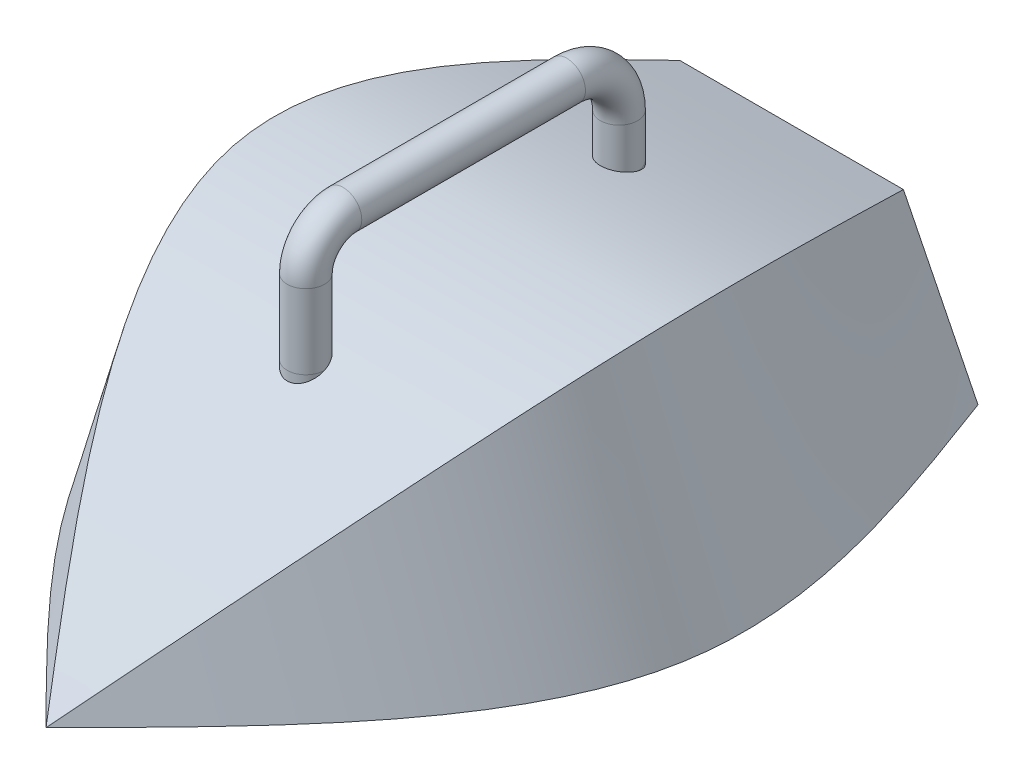
ISO-10303-21;
HEADER;
FILE_DESCRIPTION(('STEP AP214'),'2;1');
FILE_NAME('part.step','',(''),(''),'','','');
FILE_SCHEMA(('AUTOMOTIVE_DESIGN { 1 0 10303 214 1 1 1 1 }'));
ENDSEC;
DATA;
#1=APPLICATION_CONTEXT('core data for automotive mechanical design processes');
#2=APPLICATION_PROTOCOL_DEFINITION('international standard','automotive_design',2000,#1);
#3=PRODUCT_CONTEXT('',#1,'mechanical');
#4=PRODUCT('Part','Part','',(#3));
#5=PRODUCT_RELATED_PRODUCT_CATEGORY('part','',(#4));
#6=PRODUCT_DEFINITION_FORMATION('','',#4);
#7=PRODUCT_DEFINITION_CONTEXT('part definition',#1,'design');
#8=PRODUCT_DEFINITION('design','',#6,#7);
#9=PRODUCT_DEFINITION_SHAPE('','',#8);
#10=(LENGTH_UNIT() NAMED_UNIT(*) SI_UNIT(.MILLI.,.METRE.));
#11=(NAMED_UNIT(*) PLANE_ANGLE_UNIT() SI_UNIT($,.RADIAN.));
#12=(NAMED_UNIT(*) SI_UNIT($,.STERADIAN.) SOLID_ANGLE_UNIT());
#13=UNCERTAINTY_MEASURE_WITH_UNIT(LENGTH_MEASURE(1.E-05),#10,'distance_accuracy_value','');
#14=(GEOMETRIC_REPRESENTATION_CONTEXT(3) GLOBAL_UNCERTAINTY_ASSIGNED_CONTEXT((#13)) GLOBAL_UNIT_ASSIGNED_CONTEXT((#10,
#11,#12)) REPRESENTATION_CONTEXT('',''));
#15=CARTESIAN_POINT('',(0.,0.,0.));
#16=DIRECTION('',(0.,0.,1.));
#17=DIRECTION('',(1.,0.,0.));
#18=AXIS2_PLACEMENT_3D('',#15,#16,#17);
#19=CARTESIAN_POINT('',(0.,0.,0.));
#20=DIRECTION('',(0.,0.,1.));
#21=DIRECTION('',(1.,0.,0.));
#22=AXIS2_PLACEMENT_3D('',#19,#20,#21);
#23=PLANE('',#22);
#24=DIRECTION('',(-0.447213595499958,-0.894427190999916,0.));
#25=VECTOR('',#24,1.);
#26=CARTESIAN_POINT('',(-15.,20.,0.));
#27=LINE('',#26,#25);
#28=CARTESIAN_POINT('',(-15.,20.,0.));
#29=VERTEX_POINT('',#28);
#30=CARTESIAN_POINT('',(-25.,0.,0.));
#31=VERTEX_POINT('',#30);
#32=EDGE_CURVE('E214',#29,#31,#27,.T.);
#33=ORIENTED_EDGE('',*,*,#32,.F.);
#34=DIRECTION('',(-1.,0.,0.));
#35=VECTOR('',#34,1.);
#36=CARTESIAN_POINT('',(15.,20.,0.));
#37=LINE('',#36,#35);
#38=CARTESIAN_POINT('',(15.,20.,0.));
#39=VERTEX_POINT('',#38);
#40=EDGE_CURVE('E219',#39,#29,#37,.T.);
#41=ORIENTED_EDGE('',*,*,#40,.F.);
#42=DIRECTION('',(-0.447213595499958,0.894427190999916,0.));
#43=VECTOR('',#42,1.);
#44=CARTESIAN_POINT('',(25.,0.,0.));
#45=LINE('',#44,#43);
#46=CARTESIAN_POINT('',(25.,0.,0.));
#47=VERTEX_POINT('',#46);
#48=EDGE_CURVE('E213',#47,#39,#45,.T.);
#49=ORIENTED_EDGE('',*,*,#48,.F.);
#50=DIRECTION('',(1.,0.,0.));
#51=VECTOR('',#50,1.);
#52=CARTESIAN_POINT('',(-25.,0.,0.));
#53=LINE('',#52,#51);
#54=EDGE_CURVE('E204',#31,#47,#53,.T.);
#55=ORIENTED_EDGE('',*,*,#54,.F.);
#56=EDGE_LOOP('',(#33,#41,#49,#55));
#57=FACE_BOUND('',#56,.T.);
#58=DIRECTION('',(-1.,0.,0.));
#59=VECTOR('',#58,1.);
#60=CARTESIAN_POINT('',(0.,6.,0.));
#61=LINE('',#60,#59);
#62=CARTESIAN_POINT('',(4.,6.,0.));
#63=VERTEX_POINT('',#62);
#64=CARTESIAN_POINT('',(-4.,6.,0.));
#65=VERTEX_POINT('',#64);
#66=EDGE_CURVE('E125',#63,#65,#61,.T.);
#67=ORIENTED_EDGE('',*,*,#66,.F.);
#68=DIRECTION('',(0.,-1.,0.));
#69=VECTOR('',#68,1.);
#70=CARTESIAN_POINT('',(4.,0.,0.));
#71=LINE('',#70,#69);
#72=CARTESIAN_POINT('',(4.,12.,0.));
#73=VERTEX_POINT('',#72);
#74=EDGE_CURVE('E454',#73,#63,#71,.T.);
#75=ORIENTED_EDGE('',*,*,#74,.F.);
#76=DIRECTION('',(-0.894427190999916,0.447213595499958,0.));
#77=VECTOR('',#76,1.);
#78=CARTESIAN_POINT('',(0.,14.,0.));
#79=LINE('',#78,#77);
#80=CARTESIAN_POINT('',(0.,14.,0.));
#81=VERTEX_POINT('',#80);
#82=EDGE_CURVE('E286',#81,#73,#79,.F.);
#83=ORIENTED_EDGE('',*,*,#82,.F.);
#84=DIRECTION('',(-0.894427190999916,-0.447213595499958,0.));
#85=VECTOR('',#84,1.);
#86=CARTESIAN_POINT('',(0.,14.,0.));
#87=LINE('',#86,#85);
#88=CARTESIAN_POINT('',(-4.,12.,0.));
#89=VERTEX_POINT('',#88);
#90=EDGE_CURVE('E457',#89,#81,#87,.F.);
#91=ORIENTED_EDGE('',*,*,#90,.F.);
#92=DIRECTION('',(0.,-1.,0.));
#93=VECTOR('',#92,1.);
#94=CARTESIAN_POINT('',(-4.,0.,0.));
#95=LINE('',#94,#93);
#96=EDGE_CURVE('E452',#65,#89,#95,.F.);
#97=ORIENTED_EDGE('',*,*,#96,.F.);
#98=EDGE_LOOP('',(#67,#75,#83,#91,#97));
#99=FACE_BOUND('',#98,.T.);
#100=ADVANCED_FACE('F55',(#57,#99),#23,.F.);
#101=CARTESIAN_POINT('',(25.,0.,0.));
#102=CARTESIAN_POINT('',(31.4095388102639,0.,17.2166603380316));
#103=CARTESIAN_POINT('',(45.2982267037996,0.,54.5230608579921));
#104=CARTESIAN_POINT('',(15.8552403358976,0.,84.0822069139179));
#105=CARTESIAN_POINT('',(0.,0.,100.));
#106=CARTESIAN_POINT('',(21.6666666666667,6.66666666666667,0.));
#107=CARTESIAN_POINT('',(27.8564864589559,8.69332009443399,17.2166603380316));
#108=CARTESIAN_POINT('',(41.2690700717847,13.0848305852591,54.5230608579921));
#109=CARTESIAN_POINT('',(14.4449589319632,4.57993940999867,84.0822069139179));
#110=CARTESIAN_POINT('',(0.,0.,100.));
#111=CARTESIAN_POINT('',(18.3333333333333,13.3333333333333,0.));
#112=CARTESIAN_POINT('',(24.303434107648,17.386640188868,17.2166603380316));
#113=CARTESIAN_POINT('',(37.2399134397698,26.1696611705182,54.5230608579921));
#114=CARTESIAN_POINT('',(13.0346775280288,9.15987881999734,84.0822069139179));
#115=CARTESIAN_POINT('',(0.,0.,100.));
#116=CARTESIAN_POINT('',(15.,20.,0.));
#117=CARTESIAN_POINT('',(20.75038175634,26.079960283302,17.2166603380316));
#118=CARTESIAN_POINT('',(33.2107568077549,39.2544917557773,54.5230608579922));
#119=CARTESIAN_POINT('',(11.6243961240944,13.739818229996,84.0822069139179));
#120=CARTESIAN_POINT('',(0.,0.,100.));
#121=B_SPLINE_SURFACE_WITH_KNOTS('',3,3,((#101,#102,#103,#104,#105),(#106,#107,#108,#109,#110),
(#111,#112,#113,#114,#115),(#116,#117,#118,#119,#120)),.UNSPECIFIED.,.F.,.F.,.F.,(4,4),(4,1,4),
(0.,1.),(0.,0.461493472918138,1.),.UNSPECIFIED.);
#122=CARTESIAN_POINT('',(15.,20.,0.));
#123=CARTESIAN_POINT('',(20.75038175634,26.079960283302,17.2166603380316));
#124=CARTESIAN_POINT('',(33.2107568077549,39.2544917557773,54.5230608579922));
#125=CARTESIAN_POINT('',(11.6243961240944,13.739818229996,84.0822069139179));
#126=CARTESIAN_POINT('',(0.,0.,100.));
#127=B_SPLINE_CURVE_WITH_KNOTS('',3,(#122,#123,#124,#125,#126),.UNSPECIFIED.,.F.,.F.,(4,1,4),
(0.,0.461493472918138,1.),.UNSPECIFIED.);
#128=CARTESIAN_POINT('',(0.,0.,100.));
#129=VERTEX_POINT('',#128);
#130=EDGE_CURVE('E244',#39,#129,#127,.T.);
#131=CARTESIAN_POINT('',(25.,0.,0.));
#132=CARTESIAN_POINT('',(31.4095388102639,0.,17.2166603380316));
#133=CARTESIAN_POINT('',(45.2982267037996,0.,54.5230608579921));
#134=CARTESIAN_POINT('',(15.8552403358976,0.,84.0822069139179));
#135=CARTESIAN_POINT('',(0.,0.,100.));
#136=B_SPLINE_CURVE_WITH_KNOTS('',3,(#131,#132,#133,#134,#135),.UNSPECIFIED.,.F.,.F.,(4,1,4),
(0.,0.461493472918138,1.),.UNSPECIFIED.);
#137=EDGE_CURVE('E225',#129,#47,#136,.F.);
#138=ORIENTED_EDGE('',*,*,#48,.T.);
#139=ORIENTED_EDGE('',*,*,#130,.T.);
#140=ORIENTED_EDGE('',*,*,#137,.T.);
#141=EDGE_LOOP('',(#138,#139,#140));
#142=FACE_BOUND('',#141,.T.);
#143=ADVANCED_FACE('F179',(#142),#121,.T.);
#144=CARTESIAN_POINT('',(15.,20.,0.));
#145=CARTESIAN_POINT('',(20.75038175634,26.079960283302,17.2166603380316));
#146=CARTESIAN_POINT('',(33.2107568077549,39.2544917557773,54.5230608579922));
#147=CARTESIAN_POINT('',(11.6243961240944,13.739818229996,84.0822069139179));
#148=CARTESIAN_POINT('',(0.,0.,100.));
#149=CARTESIAN_POINT('',(5.,20.,0.));
#150=CARTESIAN_POINT('',(6.91679391877999,26.079960283302,17.2166603380316));
#151=CARTESIAN_POINT('',(11.0702522692516,39.2544917557773,54.5230608579922));
#152=CARTESIAN_POINT('',(3.87479870803148,13.739818229996,84.0822069139179));
#153=CARTESIAN_POINT('',(0.,0.,100.));
#154=CARTESIAN_POINT('',(-5.,20.,0.));
#155=CARTESIAN_POINT('',(-6.91679391878,26.079960283302,17.2166603380316));
#156=CARTESIAN_POINT('',(-11.0702522692516,39.2544917557773,54.5230608579922));
#157=CARTESIAN_POINT('',(-3.87479870803148,13.739818229996,84.0822069139179));
#158=CARTESIAN_POINT('',(0.,0.,100.));
#159=CARTESIAN_POINT('',(-15.,20.,0.));
#160=CARTESIAN_POINT('',(-20.75038175634,26.0799602833019,17.2166603380316));
#161=CARTESIAN_POINT('',(-33.2107568077549,39.2544917557772,54.5230608579922));
#162=CARTESIAN_POINT('',(-11.6243961240944,13.739818229996,84.0822069139179));
#163=CARTESIAN_POINT('',(0.,0.,100.));
#164=B_SPLINE_SURFACE_WITH_KNOTS('',3,3,((#144,#145,#146,#147,#148),(#149,#150,#151,#152,#153),
(#154,#155,#156,#157,#158),(#159,#160,#161,#162,#163)),.UNSPECIFIED.,.F.,.F.,.F.,(4,4),(4,1,4),
(0.,1.),(0.,0.461493472918138,1.),.UNSPECIFIED.);
#165=CARTESIAN_POINT('',(-2.5,25.3180904800573,65.1474847098218));
#166=CARTESIAN_POINT('',(-2.4999946295355,25.2818103825462,65.224472435909));
#167=CARTESIAN_POINT('',(-2.49644215789848,25.2454006550722,65.3013525584794));
#168=CARTESIAN_POINT('',(-2.48227582329261,25.1725461695074,65.4544500908209));
#169=CARTESIAN_POINT('',(-2.47166140105691,25.1361014088704,65.5306674476204));
#170=CARTESIAN_POINT('',(-2.42923482987074,25.0269555898171,65.7578522879165));
#171=CARTESIAN_POINT('',(-2.38683955253912,24.9545481754281,65.9071295023763));
#172=CARTESIAN_POINT('',(-2.27449253009456,24.8128751090817,66.1967023519491));
#173=CARTESIAN_POINT('',(-2.20451067912503,24.7436129820524,66.3369879792253));
#174=CARTESIAN_POINT('',(-2.03804649338726,24.6108438405642,66.6038666815273));
#175=CARTESIAN_POINT('',(-1.9415866497215,24.5473320022761,66.7304712509689));
#176=CARTESIAN_POINT('',(-1.729151747979,24.4317279162689,66.9594559922441));
#177=CARTESIAN_POINT('',(-1.61434355389574,24.379232406163,67.062710535397));
#178=CARTESIAN_POINT('',(-1.36481168857164,24.284680251899,67.2478079275077));
#179=CARTESIAN_POINT('',(-1.23010196186619,24.2426163533923,67.3296656583828));
#180=CARTESIAN_POINT('',(-0.960565506572578,24.1754846917221,67.4598866113774));
#181=CARTESIAN_POINT('',(-0.827379512466017,24.1490568797715,67.5109426449525));
#182=CARTESIAN_POINT('',(-0.552578960165921,24.1081602294445,67.5898268845867));
#183=CARTESIAN_POINT('',(-0.410971820272732,24.0936810278925,67.6176752191735));
#184=CARTESIAN_POINT('',(-0.139168545635756,24.0784526422288,67.6469581738524));
#185=CARTESIAN_POINT('',(-0.0092984533681768,24.076443441732,67.6508168754596));
#186=CARTESIAN_POINT('',(0.249193494828072,24.0829064145426,67.638394265931));
#187=CARTESIAN_POINT('',(0.377815630354191,24.0913761827671,67.6221175761744));
#188=CARTESIAN_POINT('',(0.625725049291091,24.1178658691097,67.5711090659493));
#189=CARTESIAN_POINT('',(0.74518076314654,24.1355555056217,67.537015393962));
#190=CARTESIAN_POINT('',(0.976370364876572,24.1794191700827,67.4522337058652));
#191=CARTESIAN_POINT('',(1.08810311068977,24.2055944496337,67.4015432417774));
#192=CARTESIAN_POINT('',(1.30644225681008,24.2667077311979,67.2827524038858));
#193=CARTESIAN_POINT('',(1.4125670483293,24.3019972701746,67.2139507348813));
#194=CARTESIAN_POINT('',(1.61178136121192,24.3792404564796,67.062641055978));
#195=CARTESIAN_POINT('',(1.70486702256492,24.4211960693725,66.9801290030933));
#196=CARTESIAN_POINT('',(1.88502501431916,24.5147236461997,66.7951878470827));
#197=CARTESIAN_POINT('',(1.97062845036492,24.5668342267441,66.6916015770673));
#198=CARTESIAN_POINT('',(2.12338088405734,24.6756920648773,66.4737489319014));
#199=CARTESIAN_POINT('',(2.1905152763022,24.7324429462965,66.3594741994074));
#200=CARTESIAN_POINT('',(2.31164666139439,24.8551736022932,66.1105201544395));
#201=CARTESIAN_POINT('',(2.36349202269977,24.9214934993045,65.974962613102));
#202=CARTESIAN_POINT('',(2.44290592015748,25.0558740667354,65.6978815793906));
#203=CARTESIAN_POINT('',(2.4705027090787,25.1239326159546,65.5563652318988));
#204=CARTESIAN_POINT('',(2.49052365008223,25.2130051687258,65.3694689256837));
#205=CARTESIAN_POINT('',(2.49407823631469,25.2340795845464,65.3251258186453));
#206=CARTESIAN_POINT('',(2.49881346504198,25.2761464793645,65.2363627879983));
#207=CARTESIAN_POINT('',(2.49999795914937,25.2971390358787,65.1919431066226));
#208=CARTESIAN_POINT('',(2.5,25.3180904800573,65.1474847098218));
#209=B_SPLINE_CURVE_WITH_KNOTS('',3,(#165,#166,#167,#168,#169,#170,#171,#172,#173,#174,#175,
#176,#177,#178,#179,#180,#181,#182,#183,#184,#185,#186,#187,#188,#189,#190,#191,#192,#193,#194,
#195,#196,#197,#198,#199,#200,#201,#202,#203,#204,#205,#206,#207,#208),.UNSPECIFIED.,.F.,.F.,(4,
2,2,2,2,2,2,2,2,2,2,2,2,2,2,2,2,2,2,2,2,4),(0.,0.255166346194898,0.510352902538191,
1.02145662487526,1.53311967745564,2.04434944778744,2.53090013822562,3.01711151687124,
3.44987435496049,3.88226145689807,4.27013543949587,4.65792041561986,5.03268215726578,
5.40749920009355,5.79978480883839,6.19218630267623,6.62280956420664,7.05377239197791,
7.53049196466335,8.00665535714301,8.15428989215023,8.30168431228934),.UNSPECIFIED.);
#210=CARTESIAN_POINT('',(-2.5,25.3180904800573,65.1474847098218));
#211=VERTEX_POINT('',#210);
#212=CARTESIAN_POINT('',(2.5,25.3180904800573,65.1474847098218));
#213=VERTEX_POINT('',#212);
#214=EDGE_CURVE('E130',#211,#213,#209,.T.);
#215=CARTESIAN_POINT('',(2.5,25.3180904800573,65.1474847098218));
#216=CARTESIAN_POINT('',(2.4999949669613,25.3535000478253,65.0723480361268));
#217=CARTESIAN_POINT('',(2.49661072798394,25.3887538026884,64.9971775668976));
#218=CARTESIAN_POINT('',(2.48304408868818,25.4587555094593,64.8471945685607));
#219=CARTESIAN_POINT('',(2.47286005552223,25.4935033378296,64.7723821297745));
#220=CARTESIAN_POINT('',(2.43199651529339,25.596808879135,64.5488765928075));
#221=CARTESIAN_POINT('',(2.39100522044102,25.6642850568391,64.4014200685268));
#222=CARTESIAN_POINT('',(2.2817319003813,25.7944109389146,64.114356282664));
#223=CARTESIAN_POINT('',(2.21339745611374,25.857051095478,63.9747646885932));
#224=CARTESIAN_POINT('',(2.05042650621097,25.9753842087061,63.708729026777));
#225=CARTESIAN_POINT('',(1.95582539885827,26.0310863700305,63.5822675771339));
#226=CARTESIAN_POINT('',(1.74890569582447,26.1304780569767,63.3548657876312));
#227=CARTESIAN_POINT('',(1.63804993175015,26.1746983683427,63.2528290227408));
#228=CARTESIAN_POINT('',(1.39761808659836,26.2538318482398,63.0691415664814));
#229=CARTESIAN_POINT('',(1.26804815069937,26.2887480612945,62.987484207039));
#230=CARTESIAN_POINT('',(1.00649372301534,26.3452531472161,62.8547731687391));
#231=CARTESIAN_POINT('',(0.875762696735058,26.3677549843547,62.8016348840541));
#232=CARTESIAN_POINT('',(0.606041109369665,26.4031093598122,62.7179541830646));
#233=CARTESIAN_POINT('',(0.467055145037277,26.4159672150022,62.6873993163203));
#234=CARTESIAN_POINT('',(0.194809963321545,26.4310403365684,62.6515613666738));
#235=CARTESIAN_POINT('',(0.0617891588800143,26.4339096884137,62.6447252006526));
#236=CARTESIAN_POINT('',(-0.203532155717489,26.4307464807133,62.6522537302315));
#237=CARTESIAN_POINT('',(-0.335832783462414,26.4247154210072,62.666614853802));
#238=CARTESIAN_POINT('',(-0.592936270153666,26.4041853438715,62.7153721372722));
#239=CARTESIAN_POINT('',(-0.717840196313117,26.3898763265204,62.7493187156204));
#240=CARTESIAN_POINT('',(-0.959900663760665,26.3533923354353,62.8355354604305));
#241=CARTESIAN_POINT('',(-1.07705670074666,26.3312168502777,62.887806818241));
#242=CARTESIAN_POINT('',(-1.30363788895114,26.2789805881738,63.0103111601942));
#243=CARTESIAN_POINT('',(-1.41279666070626,26.2487365960676,63.0809603852637));
#244=CARTESIAN_POINT('',(-1.56631391524215,26.1983568542513,63.1979161589307));
#245=CARTESIAN_POINT('',(-1.6157958480929,26.1807220792602,63.2387453125907));
#246=CARTESIAN_POINT('',(-1.71120123874289,26.1438750013688,63.3237865142779));
#247=CARTESIAN_POINT('',(-1.75712218321884,26.1246616036342,63.3680009086238));
#248=CARTESIAN_POINT('',(-1.89461400844296,26.062377470162,63.5108476141786));
#249=CARTESIAN_POINT('',(-1.97956402917588,26.0167366242601,63.6148518779315));
#250=CARTESIAN_POINT('',(-2.13090105388502,25.9200733884609,63.8333515125748));
#251=CARTESIAN_POINT('',(-2.19727744327247,25.869047944179,63.9478528329789));
#252=CARTESIAN_POINT('',(-2.28469228531845,25.7871864820734,64.1300179997465));
#253=CARTESIAN_POINT('',(-2.31257791835452,25.7577970711169,64.1951368792361));
#254=CARTESIAN_POINT('',(-2.36259005632193,25.6979988071411,64.3270368897329));
#255=CARTESIAN_POINT('',(-2.38472137103392,25.6675908296541,64.3938165810473));
#256=CARTESIAN_POINT('',(-2.42319826705614,25.6059392542508,64.5285972831603));
#257=CARTESIAN_POINT('',(-2.43954643995611,25.5746960373976,64.5965977325108));
#258=CARTESIAN_POINT('',(-2.46645687115453,25.5115461267651,64.7334201277284));
#259=CARTESIAN_POINT('',(-2.47702016101821,25.4796395523304,64.802241924894));
#260=CARTESIAN_POINT('',(-2.48980466890957,25.4260850186075,64.9172382279052));
#261=CARTESIAN_POINT('',(-2.4936335977201,25.4045688250284,64.9633020328226));
#262=CARTESIAN_POINT('',(-2.49872889933693,25.3614164242406,65.0554126018704));
#263=CARTESIAN_POINT('',(-2.49999992803062,25.3397805070942,65.1014592441544));
#264=CARTESIAN_POINT('',(-2.5,25.3180904800573,65.1474847098218));
#265=B_SPLINE_CURVE_WITH_KNOTS('',3,(#215,#216,#217,#218,#219,#220,#221,#222,#223,#224,#225,
#226,#227,#228,#229,#230,#231,#232,#233,#234,#235,#236,#237,#238,#239,#240,#241,#242,#243,#244,
#245,#246,#247,#248,#249,#250,#251,#252,#253,#254,#255,#256,#257,#258,#259,#260,#261,#262,#263,
#264),.UNSPECIFIED.,.F.,.F.,(4,2,2,2,2,2,2,2,2,2,2,2,2,2,2,2,2,2,2,2,2,2,2,2,4),(0.,
0.249044002036297,0.498147829002152,0.997353923342901,1.49752165733248,1.99701858455061,
2.46553481837282,2.9338975536774,3.36035142424096,3.78657001125301,4.18429162680227,
4.58194622854029,4.97081664341922,5.35971234461072,5.75832714106048,5.95775143112767,
6.15731521620368,6.5808971194829,7.00472060221306,7.23459167309669,7.46426998269552,
7.6938452361589,7.92337953822788,8.07627486047372,8.2288916301692),.UNSPECIFIED.);
#266=EDGE_CURVE('E12',#213,#211,#265,.T.);
#267=CARTESIAN_POINT('',(-2.5,27.4715369369645,23.1474847098219));
#268=CARTESIAN_POINT('',(-2.49999820150626,27.4902768493565,23.2193269991436));
#269=CARTESIAN_POINT('',(-2.49690132920489,27.5089476049854,23.2911517637222));
#270=CARTESIAN_POINT('',(-2.48452970761197,27.5460404175695,23.434334584736));
#271=CARTESIAN_POINT('',(-2.4752547159248,27.5644624647378,23.5056926227485));
#272=CARTESIAN_POINT('',(-2.4381950937486,27.6191674379101,23.7183316802619));
#273=CARTESIAN_POINT('',(-2.40117578272289,27.654910308843,23.8582586033268));
#274=CARTESIAN_POINT('',(-2.30328629611135,27.7239173928392,24.130238675853));
#275=CARTESIAN_POINT('',(-2.24239489559906,27.7571793687011,24.2622846976056));
#276=CARTESIAN_POINT('',(-2.09823729958064,27.8202847356828,24.5144002919742));
#277=CARTESIAN_POINT('',(-2.01498263498521,27.8501298773062,24.6344759930814));
#278=CARTESIAN_POINT('',(-1.82989274609489,27.9050976716726,24.8568882194876));
#279=CARTESIAN_POINT('',(-1.72840913788116,27.9302939919958,24.9594990111268));
#280=CARTESIAN_POINT('',(-1.50864855490854,27.9759173175774,25.1461734267165));
#281=CARTESIAN_POINT('',(-1.39037097140117,27.9963441498802,25.2302363780622));
#282=CARTESIAN_POINT('',(-1.14415195171087,28.0313335736909,25.374745976527));
#283=CARTESIAN_POINT('',(-1.01659822915071,28.0460512995403,25.4358158112235));
#284=CARTESIAN_POINT('',(-0.752585243233753,28.0700665380196,25.5356897031491));
#285=CARTESIAN_POINT('',(-0.616127963108259,28.07936525316,25.5744987001597));
#286=CARTESIAN_POINT('',(-0.34170332738975,28.0921416897989,25.6278702799851));
#287=CARTESIAN_POINT('',(-0.203850785306936,28.0957537406162,25.642992345843));
#288=CARTESIAN_POINT('',(0.0724950918685808,28.0974884321397,25.6502513442606));
#289=CARTESIAN_POINT('',(0.210988388875216,28.0956113950328,25.6423896258738));
#290=CARTESIAN_POINT('',(0.483173096780182,28.086467242315,25.6041594942595));
#291=CARTESIAN_POINT('',(0.616899151768626,28.0792555037119,25.5740223145794));
#292=CARTESIAN_POINT('',(0.877357374292831,28.0596756141469,25.4924455525129));
#293=CARTESIAN_POINT('',(1.00408949840762,28.047307431176,25.4410058378892));
#294=CARTESIAN_POINT('',(1.18658773423428,28.0250971206751,25.3490103932356));
#295=CARTESIAN_POINT('',(1.24635507051916,28.0170483603828,25.3157257022928));
#296=CARTESIAN_POINT('',(1.36284578866123,27.9997780344698,25.2444601103856));
#297=CARTESIAN_POINT('',(1.41956978727927,27.990556707767,25.2064801661528));
#298=CARTESIAN_POINT('',(1.52958077747702,27.9710006770156,25.1261260556953));
#299=CARTESIAN_POINT('',(1.58286885569373,27.9606663277577,25.0837532899008));
#300=CARTESIAN_POINT('',(1.68573074816179,27.9389396492606,24.9948990765471));
#301=CARTESIAN_POINT('',(1.73530131069134,27.9275464128711,24.9484141077299));
#302=CARTESIAN_POINT('',(1.87980586454325,27.8914134388661,24.8013974252271));
#303=CARTESIAN_POINT('',(1.96838641736522,27.8651011906327,24.6948731426466));
#304=CARTESIAN_POINT('',(2.12644810391769,27.8090232175639,24.4693000423468));
#305=CARTESIAN_POINT('',(2.19592544913467,27.779256809368,24.3502487467565));
#306=CARTESIAN_POINT('',(2.2855130567429,27.7321431045171,24.163074107906));
#307=CARTESIAN_POINT('',(2.31322695281511,27.7157712309409,24.0982423433505));
#308=CARTESIAN_POINT('',(2.36302939061127,27.6824267812109,23.966649849573));
#309=CARTESIAN_POINT('',(2.38512255922323,27.6654547123236,23.8998907576367));
#310=CARTESIAN_POINT('',(2.42356882881081,27.6310252714115,23.7649279726231));
#311=CARTESIAN_POINT('',(2.43992632118313,27.6135682817566,23.6967254273061));
#312=CARTESIAN_POINT('',(2.46684260050348,27.5782711168626,23.5592948496301));
#313=CARTESIAN_POINT('',(2.47740280929838,27.5604310366971,23.4900670730016));
#314=CARTESIAN_POINT('',(2.49002967202888,27.5307204258376,23.3751667592637));
#315=CARTESIAN_POINT('',(2.49377183901649,27.5189254344701,23.3296518730561));
#316=CARTESIAN_POINT('',(2.49875503884994,27.4952743001599,23.2385855089615));
#317=CARTESIAN_POINT('',(2.50000038799378,27.4834182983327,23.1930342306413));
#318=CARTESIAN_POINT('',(2.5,27.4715369369645,23.1474847098219));
#319=B_SPLINE_CURVE_WITH_KNOTS('',3,(#267,#268,#269,#270,#271,#272,#273,#274,#275,#276,#277,
#278,#279,#280,#281,#282,#283,#284,#285,#286,#287,#288,#289,#290,#291,#292,#293,#294,#295,#296,
#297,#298,#299,#300,#301,#302,#303,#304,#305,#306,#307,#308,#309,#310,#311,#312,#313,#314,#315,
#316,#317,#318),.UNSPECIFIED.,.F.,.F.,(4,2,2,2,2,2,2,2,2,2,2,2,2,2,2,2,2,2,2,2,2,2,2,2,2,4),(0.,
0.222604929502365,0.445218593319757,0.890198060706461,1.33557406457345,1.78072086372955,
2.21805772531709,2.65541044355213,3.07986917038542,3.50423367141181,3.91841488262147,
4.33257178358753,4.74248880260394,5.15240836625405,5.35885980611012,5.56526924737158,
5.77161308654731,5.97813535958585,6.39913957391235,6.8202272209093,7.03716700592186,
7.25392762768282,7.47052192711438,7.6870630806776,7.82850274620697,7.96969769065434),.UNSPECIFIED.);
#320=CARTESIAN_POINT('',(-2.5,27.4715369369645,23.1474847098219));
#321=VERTEX_POINT('',#320);
#322=CARTESIAN_POINT('',(2.5,27.4715369369645,23.1474847098219));
#323=VERTEX_POINT('',#322);
#324=EDGE_CURVE('E73',#321,#323,#319,.T.);
#325=CARTESIAN_POINT('',(2.5,27.4715369369645,23.1474847098219));
#326=CARTESIAN_POINT('',(2.49999817697648,27.4526758082933,23.0751750408588));
#327=CARTESIAN_POINT('',(2.49686098609712,27.4337624862056,23.0029160659738));
#328=CARTESIAN_POINT('',(2.48434472223536,27.3959508606298,22.858937097629));
#329=CARTESIAN_POINT('',(2.47496566360759,27.3770525571074,22.7872171029301));
#330=CARTESIAN_POINT('',(2.43752616552585,27.3205851240022,22.5736197238226));
#331=CARTESIAN_POINT('',(2.40016331587587,27.2832171282519,22.4332040044831));
#332=CARTESIAN_POINT('',(2.30151305240365,27.2102176988091,22.1605189971117));
#333=CARTESIAN_POINT('',(2.24020920793449,27.1745874766778,22.0282553761785));
#334=CARTESIAN_POINT('',(2.09517782412623,27.1062361736717,21.7758468651761));
#335=CARTESIAN_POINT('',(2.01145961702569,27.0735138896091,21.6556969601451));
#336=CARTESIAN_POINT('',(1.82503630104396,27.012548142957,21.4328253384279));
#337=CARTESIAN_POINT('',(1.72261338442019,26.9842483959688,21.3298831983341));
#338=CARTESIAN_POINT('',(1.50072765828214,26.9326318258816,21.1427737637938));
#339=CARTESIAN_POINT('',(1.38126516816101,26.9093149094038,21.0586061175102));
#340=CARTESIAN_POINT('',(1.13301542617596,26.8692952829847,20.9145098679164));
#341=CARTESIAN_POINT('',(1.00467958780308,26.8523957211715,20.8538583996541));
#342=CARTESIAN_POINT('',(0.739016625699216,26.8248119334198,20.7550120536401));
#343=CARTESIAN_POINT('',(0.601692049710421,26.8141259547352,20.7168108430204));
#344=CARTESIAN_POINT('',(0.326890592006491,26.7996637333601,20.6651395103976));
#345=CARTESIAN_POINT('',(0.189572191232148,26.7956684934214,20.6508855099822));
#346=CARTESIAN_POINT('',(-0.0855751437936141,26.7940658022458,20.6451655650604));
#347=CARTESIAN_POINT('',(-0.223404026979037,26.7964577284324,20.6536973995495));
#348=CARTESIAN_POINT('',(-0.493412628021958,26.8074407759169,20.6929209951479));
#349=CARTESIAN_POINT('',(-0.625646644834226,26.8159359100801,20.7232696406242));
#350=CARTESIAN_POINT('',(-0.883084283813892,26.8387000042461,20.8047583084526));
#351=CARTESIAN_POINT('',(-1.00828773761727,26.8529691024536,20.8558988284756));
#352=CARTESIAN_POINT('',(-1.18878748120665,26.8783619342441,20.9471628411993));
#353=CARTESIAN_POINT('',(-1.24803940561652,26.8875523480167,20.9802307383364));
#354=CARTESIAN_POINT('',(-1.36351752545189,26.9071813933086,21.0509644848248));
#355=CARTESIAN_POINT('',(-1.41974431797768,26.9176197771832,21.0886294219801));
#356=CARTESIAN_POINT('',(-1.52879845480101,26.9396508635889,21.1682593252257));
#357=CARTESIAN_POINT('',(-1.58162674044195,26.9512432441915,21.2102230921731));
#358=CARTESIAN_POINT('',(-1.68362090795807,26.9754929879777,21.2981703271655));
#359=CARTESIAN_POINT('',(-1.73278363301601,26.9881512495826,21.3441571875359));
#360=CARTESIAN_POINT('',(-1.87702354482832,27.0283289878606,21.4904209414708));
#361=CARTESIAN_POINT('',(-1.96570846126122,27.0574149845736,21.5967059563572));
#362=CARTESIAN_POINT('',(-2.12404195121639,27.1187084983135,21.8218174672333));
#363=CARTESIAN_POINT('',(-2.19368613651091,27.1509167325949,21.9406468455316));
#364=CARTESIAN_POINT('',(-2.28378230707265,27.2014103828265,22.1279806203827));
#365=CARTESIAN_POINT('',(-2.31177336672256,27.2189319231045,22.19316501306));
#366=CARTESIAN_POINT('',(-2.36207372757518,27.2544059984037,22.325529272636));
#367=CARTESIAN_POINT('',(-2.38438767857486,27.2723581674465,22.3927074558435));
#368=CARTESIAN_POINT('',(-2.4232083866468,27.3085540659576,22.5285734718276));
#369=CARTESIAN_POINT('',(-2.43971993198326,27.326797541973,22.597260009905));
#370=CARTESIAN_POINT('',(-2.46686644972384,27.363458125083,22.7357270397934));
#371=CARTESIAN_POINT('',(-2.47750292810137,27.3818751864497,22.8055072465406));
#372=CARTESIAN_POINT('',(-2.49011383129841,27.4121973131359,22.9207702083992));
#373=CARTESIAN_POINT('',(-2.49382329906303,27.4240902966143,22.9660736228404));
#374=CARTESIAN_POINT('',(-2.49876447742682,27.4478420559146,23.0567427161175));
#375=CARTESIAN_POINT('',(-2.50000034133776,27.459700855636,23.102108162385));
#376=CARTESIAN_POINT('',(-2.5,27.4715369369645,23.1474847098219));
#377=B_SPLINE_CURVE_WITH_KNOTS('',3,(#325,#326,#327,#328,#329,#330,#331,#332,#333,#334,#335,
#336,#337,#338,#339,#340,#341,#342,#343,#344,#345,#346,#347,#348,#349,#350,#351,#352,#353,#354,
#355,#356,#357,#358,#359,#360,#361,#362,#363,#364,#365,#366,#367,#368,#369,#370,#371,#372,#373,
#374,#375,#376),.UNSPECIFIED.,.F.,.F.,(4,2,2,2,2,2,2,2,2,2,2,2,2,2,2,2,2,2,2,2,2,2,2,2,2,4),(0.,
0.224050038807157,0.448099562360671,0.895889585086439,1.34398746661969,1.79189907157238,
2.23354060985637,2.67517387101126,3.10188607527845,3.52847785283045,3.94081231331532,
4.35310658377654,4.75905466022278,5.1650124539458,5.37024349959864,5.57543388702351,
5.78056719239548,5.98587516752939,6.40818252778517,6.83058713334615,7.0495919816951,
7.26841687394037,7.48706076098813,7.7056485763565,7.84654358155285,7.98720181745413),.UNSPECIFIED.);
#378=EDGE_CURVE('E84',#323,#321,#377,.T.);
#379=CARTESIAN_POINT('',(-15.,20.,0.));
#380=CARTESIAN_POINT('',(-20.75038175634,26.0799602833019,17.2166603380316));
#381=CARTESIAN_POINT('',(-33.2107568077549,39.2544917557772,54.5230608579922));
#382=CARTESIAN_POINT('',(-11.6243961240944,13.739818229996,84.0822069139179));
#383=CARTESIAN_POINT('',(0.,0.,100.));
#384=B_SPLINE_CURVE_WITH_KNOTS('',3,(#379,#380,#381,#382,#383),.UNSPECIFIED.,.F.,.F.,(4,1,4),
(0.,0.461493472918138,1.),.UNSPECIFIED.);
#385=EDGE_CURVE('E246',#29,#129,#384,.T.);
#386=ORIENTED_EDGE('',*,*,#214,.F.);
#387=ORIENTED_EDGE('',*,*,#266,.F.);
#388=EDGE_LOOP('',(#386,#387));
#389=FACE_BOUND('',#388,.T.);
#390=ORIENTED_EDGE('',*,*,#324,.F.);
#391=ORIENTED_EDGE('',*,*,#378,.F.);
#392=EDGE_LOOP('',(#390,#391));
#393=FACE_BOUND('',#392,.T.);
#394=ORIENTED_EDGE('',*,*,#40,.T.);
#395=ORIENTED_EDGE('',*,*,#385,.T.);
#396=ORIENTED_EDGE('',*,*,#130,.F.);
#397=EDGE_LOOP('',(#394,#395,#396));
#398=FACE_BOUND('',#397,.T.);
#399=ADVANCED_FACE('F119',(#389,#393,#398),#164,.T.);
#400=CARTESIAN_POINT('',(-25.,0.,0.));
#401=DIRECTION('',(0.,-1.,0.));
#402=DIRECTION('',(1.,0.,0.));
#403=AXIS2_PLACEMENT_3D('',#400,#401,#402);
#404=PLANE('',#403);
#405=ORIENTED_EDGE('',*,*,#54,.T.);
#406=ORIENTED_EDGE('',*,*,#137,.F.);
#407=CARTESIAN_POINT('',(-25.,0.,0.));
#408=CARTESIAN_POINT('',(-31.4095388102639,0.,17.2166603380316));
#409=CARTESIAN_POINT('',(-45.2982267037996,0.,54.5230608579922));
#410=CARTESIAN_POINT('',(-15.8552403358975,0.,84.0822069139179));
#411=CARTESIAN_POINT('',(0.,0.,100.));
#412=B_SPLINE_CURVE_WITH_KNOTS('',3,(#407,#408,#409,#410,#411),.UNSPECIFIED.,.F.,.F.,(4,1,4),
(0.,0.461493472918138,1.),.UNSPECIFIED.);
#413=EDGE_CURVE('E252',#31,#129,#412,.T.);
#414=ORIENTED_EDGE('',*,*,#413,.F.);
#415=EDGE_LOOP('',(#405,#406,#414));
#416=FACE_BOUND('',#415,.T.);
#417=ADVANCED_FACE('F298',(#416),#404,.T.);
#418=CARTESIAN_POINT('',(-15.,20.,0.));
#419=CARTESIAN_POINT('',(-20.75038175634,26.0799602833019,17.2166603380316));
#420=CARTESIAN_POINT('',(-33.2107568077549,39.2544917557772,54.5230608579922));
#421=CARTESIAN_POINT('',(-11.6243961240944,13.739818229996,84.0822069139179));
#422=CARTESIAN_POINT('',(0.,0.,100.));
#423=CARTESIAN_POINT('',(-18.3333333333333,13.3333333333333,0.));
#424=CARTESIAN_POINT('',(-24.303434107648,17.386640188868,17.2166603380316));
#425=CARTESIAN_POINT('',(-37.2399134397698,26.1696611705182,54.5230608579922));
#426=CARTESIAN_POINT('',(-13.0346775280288,9.15987881999732,84.0822069139179));
#427=CARTESIAN_POINT('',(0.,0.,100.));
#428=CARTESIAN_POINT('',(-21.6666666666667,6.66666666666667,0.));
#429=CARTESIAN_POINT('',(-27.8564864589559,8.69332009443398,17.2166603380316));
#430=CARTESIAN_POINT('',(-41.2690700717847,13.0848305852591,54.5230608579922));
#431=CARTESIAN_POINT('',(-14.4449589319632,4.57993940999866,84.0822069139179));
#432=CARTESIAN_POINT('',(0.,0.,100.));
#433=CARTESIAN_POINT('',(-25.,0.,0.));
#434=CARTESIAN_POINT('',(-31.4095388102639,0.,17.2166603380316));
#435=CARTESIAN_POINT('',(-45.2982267037996,0.,54.5230608579922));
#436=CARTESIAN_POINT('',(-15.8552403358975,0.,84.0822069139179));
#437=CARTESIAN_POINT('',(0.,0.,100.));
#438=B_SPLINE_SURFACE_WITH_KNOTS('',3,3,((#418,#419,#420,#421,#422),(#423,#424,#425,#426,#427),
(#428,#429,#430,#431,#432),(#433,#434,#435,#436,#437)),.UNSPECIFIED.,.F.,.F.,.F.,(4,4),(4,1,4),
(0.,1.),(0.,0.461493472918138,1.),.UNSPECIFIED.);
#439=ORIENTED_EDGE('',*,*,#32,.T.);
#440=ORIENTED_EDGE('',*,*,#413,.T.);
#441=ORIENTED_EDGE('',*,*,#385,.F.);
#442=EDGE_LOOP('',(#439,#440,#441));
#443=FACE_BOUND('',#442,.T.);
#444=ADVANCED_FACE('F57',(#443),#438,.T.);
#445=CARTESIAN_POINT('',(0.,6.,0.));
#446=DIRECTION('',(0.,1.,0.));
#447=DIRECTION('',(0.,0.,1.));
#448=AXIS2_PLACEMENT_3D('',#445,#446,#447);
#449=PLANE('',#448);
#450=ORIENTED_EDGE('',*,*,#66,.T.);
#451=CARTESIAN_POINT('',(0.,6.,0.));
#452=DIRECTION('',(0.,-1.,0.));
#453=DIRECTION('',(0.,0.,-1.));
#454=AXIS2_PLACEMENT_3D('',#451,#452,#453);
#455=CIRCLE('',#454,4.);
#456=EDGE_CURVE('E235',#63,#65,#455,.T.);
#457=ORIENTED_EDGE('',*,*,#456,.F.);
#458=EDGE_LOOP('',(#450,#457));
#459=FACE_BOUND('',#458,.T.);
#460=ADVANCED_FACE('F172',(#459),#449,.T.);
#461=CARTESIAN_POINT('',(0.,0.,0.));
#462=DIRECTION('',(0.,-1.,0.));
#463=DIRECTION('',(0.,0.,-1.));
#464=AXIS2_PLACEMENT_3D('',#461,#462,#463);
#465=CYLINDRICAL_SURFACE('',#464,4.);
#466=ORIENTED_EDGE('',*,*,#96,.T.);
#467=CARTESIAN_POINT('',(0.,12.,0.));
#468=DIRECTION('',(0.,-1.,0.));
#469=DIRECTION('',(0.,0.,-1.));
#470=AXIS2_PLACEMENT_3D('',#467,#468,#469);
#471=CIRCLE('',#470,4.);
#472=EDGE_CURVE('E317',#73,#89,#471,.T.);
#473=ORIENTED_EDGE('',*,*,#472,.F.);
#474=ORIENTED_EDGE('',*,*,#74,.T.);
#475=ORIENTED_EDGE('',*,*,#456,.T.);
#476=EDGE_LOOP('',(#466,#473,#474,#475));
#477=FACE_BOUND('',#476,.T.);
#478=ADVANCED_FACE('F168',(#477),#465,.F.);
#479=CARTESIAN_POINT('',(0.,14.,0.));
#480=DIRECTION('',(0.,-1.,0.));
#481=DIRECTION('',(0.,0.,-1.));
#482=AXIS2_PLACEMENT_3D('',#479,#480,#481);
#483=CONICAL_SURFACE('',#482,0.,1.10714871779409);
#484=ORIENTED_EDGE('',*,*,#90,.T.);
#485=ORIENTED_EDGE('',*,*,#82,.T.);
#486=ORIENTED_EDGE('',*,*,#472,.T.);
#487=EDGE_LOOP('',(#484,#485,#486));
#488=FACE_BOUND('',#487,.T.);
#489=ADVANCED_FACE('F162',(#488),#483,.F.);
#490=CARTESIAN_POINT('',(0.,0.,65.1474847098218));
#491=DIRECTION('',(0.,1.,0.));
#492=DIRECTION('',(0.,0.,1.));
#493=AXIS2_PLACEMENT_3D('',#490,#491,#492);
#494=CYLINDRICAL_SURFACE('',#493,2.5);
#495=CARTESIAN_POINT('',(0.,25.3180904800573,65.1474847098218));
#496=DIRECTION('',(0.,1.,0.));
#497=DIRECTION('',(0.,0.,1.));
#498=AXIS2_PLACEMENT_3D('',#495,#496,#497);
#499=CIRCLE('',#498,2.5);
#500=EDGE_CURVE('E320',#211,#213,#499,.T.);
#501=ORIENTED_EDGE('',*,*,#500,.F.);
#502=ORIENTED_EDGE('',*,*,#214,.T.);
#503=EDGE_LOOP('',(#501,#502));
#504=FACE_BOUND('',#503,.T.);
#505=ADVANCED_FACE('F167',(#504),#494,.T.);
#506=CARTESIAN_POINT('',(0.,25.3180904800573,65.1474847098218));
#507=DIRECTION('',(0.,1.,0.));
#508=DIRECTION('',(0.,0.,1.));
#509=AXIS2_PLACEMENT_3D('',#506,#507,#508);
#510=CYLINDRICAL_SURFACE('',#509,2.5);
#511=CARTESIAN_POINT('',(0.,35.3180904800573,65.1474847098218));
#512=DIRECTION('',(0.,1.,0.));
#513=DIRECTION('',(0.,0.,1.));
#514=AXIS2_PLACEMENT_3D('',#511,#512,#513);
#515=CIRCLE('',#514,2.5);
#516=CARTESIAN_POINT('',(0.,35.3180904800573,67.6474847098219));
#517=VERTEX_POINT('',#516);
#518=EDGE_CURVE('E322',#517,#517,#515,.T.);
#519=ORIENTED_EDGE('',*,*,#518,.F.);
#520=EDGE_LOOP('',(#519));
#521=FACE_BOUND('',#520,.T.);
#522=ORIENTED_EDGE('',*,*,#500,.T.);
#523=ORIENTED_EDGE('',*,*,#266,.T.);
#524=EDGE_LOOP('',(#522,#523));
#525=FACE_BOUND('',#524,.T.);
#526=ADVANCED_FACE('F319',(#521,#525),#510,.T.);
#527=CARTESIAN_POINT('',(0.,35.3180904800573,60.1474847098218));
#528=DIRECTION('',(-1.,0.,0.));
#529=DIRECTION('',(0.,0.,1.));
#530=AXIS2_PLACEMENT_3D('',#527,#528,#529);
#531=TOROIDAL_SURFACE('',#530,5.,2.5);
#532=CARTESIAN_POINT('',(0.,40.3180904800573,60.1474847098218));
#533=DIRECTION('',(0.,0.,-1.));
#534=DIRECTION('',(0.,1.,0.));
#535=AXIS2_PLACEMENT_3D('',#532,#533,#534);
#536=CIRCLE('',#535,2.5);
#537=CARTESIAN_POINT('',(0.,42.8180904800573,60.1474847098218));
#538=VERTEX_POINT('',#537);
#539=EDGE_CURVE('E326',#538,#538,#536,.T.);
#540=CARTESIAN_POINT('',(0.,35.3180904800573,60.1474847098218));
#541=DIRECTION('',(-1.,0.,0.));
#542=DIRECTION('',(0.,0.,1.));
#543=AXIS2_PLACEMENT_3D('',#540,#541,#542);
#544=CIRCLE('',#543,7.5);
#545=EDGE_CURVE('',#517,#538,#544,.T.);
#546=ORIENTED_EDGE('',*,*,#518,.T.);
#547=ORIENTED_EDGE('',*,*,#539,.F.);
#548=ORIENTED_EDGE('',*,*,#545,.T.);
#549=ORIENTED_EDGE('',*,*,#545,.F.);
#550=EDGE_LOOP('',(#546,#548,#547,#549));
#551=FACE_BOUND('',#550,.T.);
#552=ADVANCED_FACE('F340',(#551),#531,.T.);
#553=CARTESIAN_POINT('',(0.,40.3180904800573,60.1474847098218));
#554=DIRECTION('',(0.,0.,-1.));
#555=DIRECTION('',(-1.,0.,0.));
#556=AXIS2_PLACEMENT_3D('',#553,#554,#555);
#557=CYLINDRICAL_SURFACE('',#556,2.5);
#558=CARTESIAN_POINT('',(0.,40.3180904800573,30.1474847098218));
#559=DIRECTION('',(0.,0.,-1.));
#560=DIRECTION('',(0.,1.,0.));
#561=AXIS2_PLACEMENT_3D('',#558,#559,#560);
#562=CIRCLE('',#561,2.5);
#563=CARTESIAN_POINT('',(0.,42.8180904800573,30.1474847098218));
#564=VERTEX_POINT('',#563);
#565=EDGE_CURVE('E139',#564,#564,#562,.T.);
#566=ORIENTED_EDGE('',*,*,#565,.F.);
#567=EDGE_LOOP('',(#566));
#568=FACE_BOUND('',#567,.T.);
#569=ORIENTED_EDGE('',*,*,#539,.T.);
#570=EDGE_LOOP('',(#569));
#571=FACE_BOUND('',#570,.T.);
#572=ADVANCED_FACE('F337',(#568,#571),#557,.T.);
#573=CARTESIAN_POINT('',(0.,33.3180904800573,30.1474847098218));
#574=DIRECTION('',(-1.,0.,0.));
#575=DIRECTION('',(0.,0.,1.));
#576=AXIS2_PLACEMENT_3D('',#573,#574,#575);
#577=TOROIDAL_SURFACE('',#576,7.,2.5);
#578=CARTESIAN_POINT('',(0.,33.3180904800573,23.1474847098218));
#579=DIRECTION('',(0.,-1.,0.));
#580=DIRECTION('',(0.,0.,-1.));
#581=AXIS2_PLACEMENT_3D('',#578,#579,#580);
#582=CIRCLE('',#581,2.5);
#583=CARTESIAN_POINT('',(0.,33.3180904800573,20.6474847098218));
#584=VERTEX_POINT('',#583);
#585=EDGE_CURVE('E135',#584,#584,#582,.T.);
#586=CARTESIAN_POINT('',(0.,33.3180904800573,30.1474847098218));
#587=DIRECTION('',(-1.,0.,0.));
#588=DIRECTION('',(0.,0.,1.));
#589=AXIS2_PLACEMENT_3D('',#586,#587,#588);
#590=CIRCLE('',#589,9.5);
#591=EDGE_CURVE('',#564,#584,#590,.T.);
#592=ORIENTED_EDGE('',*,*,#565,.T.);
#593=ORIENTED_EDGE('',*,*,#585,.F.);
#594=ORIENTED_EDGE('',*,*,#591,.T.);
#595=ORIENTED_EDGE('',*,*,#591,.F.);
#596=EDGE_LOOP('',(#592,#594,#593,#595));
#597=FACE_BOUND('',#596,.T.);
#598=ADVANCED_FACE('F335',(#597),#577,.T.);
#599=CARTESIAN_POINT('',(0.,33.3180904800573,23.1474847098218));
#600=DIRECTION('',(0.,-1.,0.));
#601=DIRECTION('',(0.,0.,-1.));
#602=AXIS2_PLACEMENT_3D('',#599,#600,#601);
#603=CYLINDRICAL_SURFACE('',#602,2.5);
#604=CARTESIAN_POINT('',(0.,27.4715369369645,23.1474847098218));
#605=DIRECTION('',(0.,-1.,0.));
#606=DIRECTION('',(0.,0.,-1.));
#607=AXIS2_PLACEMENT_3D('',#604,#605,#606);
#608=CIRCLE('',#607,2.5);
#609=EDGE_CURVE('E128',#321,#323,#608,.T.);
#610=ORIENTED_EDGE('',*,*,#609,.F.);
#611=ORIENTED_EDGE('',*,*,#324,.T.);
#612=EDGE_LOOP('',(#610,#611));
#613=FACE_BOUND('',#612,.T.);
#614=ORIENTED_EDGE('',*,*,#585,.T.);
#615=EDGE_LOOP('',(#614));
#616=FACE_BOUND('',#615,.T.);
#617=ADVANCED_FACE('F132',(#613,#616),#603,.T.);
#618=CARTESIAN_POINT('',(0.,27.4715369369645,23.1474847098218));
#619=DIRECTION('',(0.,-1.,0.));
#620=DIRECTION('',(0.,0.,-1.));
#621=AXIS2_PLACEMENT_3D('',#618,#619,#620);
#622=CYLINDRICAL_SURFACE('',#621,2.5);
#623=ORIENTED_EDGE('',*,*,#609,.T.);
#624=ORIENTED_EDGE('',*,*,#378,.T.);
#625=EDGE_LOOP('',(#623,#624));
#626=FACE_BOUND('',#625,.T.);
#627=ADVANCED_FACE('F127',(#626),#622,.T.);
#628=CLOSED_SHELL('',(#100,#143,#399,#417,#444,#460,#478,#489,#505,#526,#552,#572,#598,#617,#627));
#629=MANIFOLD_SOLID_BREP('B2',#628);
#630=ADVANCED_BREP_SHAPE_REPRESENTATION('',(#18,#629),#14);
#631=SHAPE_DEFINITION_REPRESENTATION(#9,#630);
ENDSEC;
END-ISO-10303-21;
